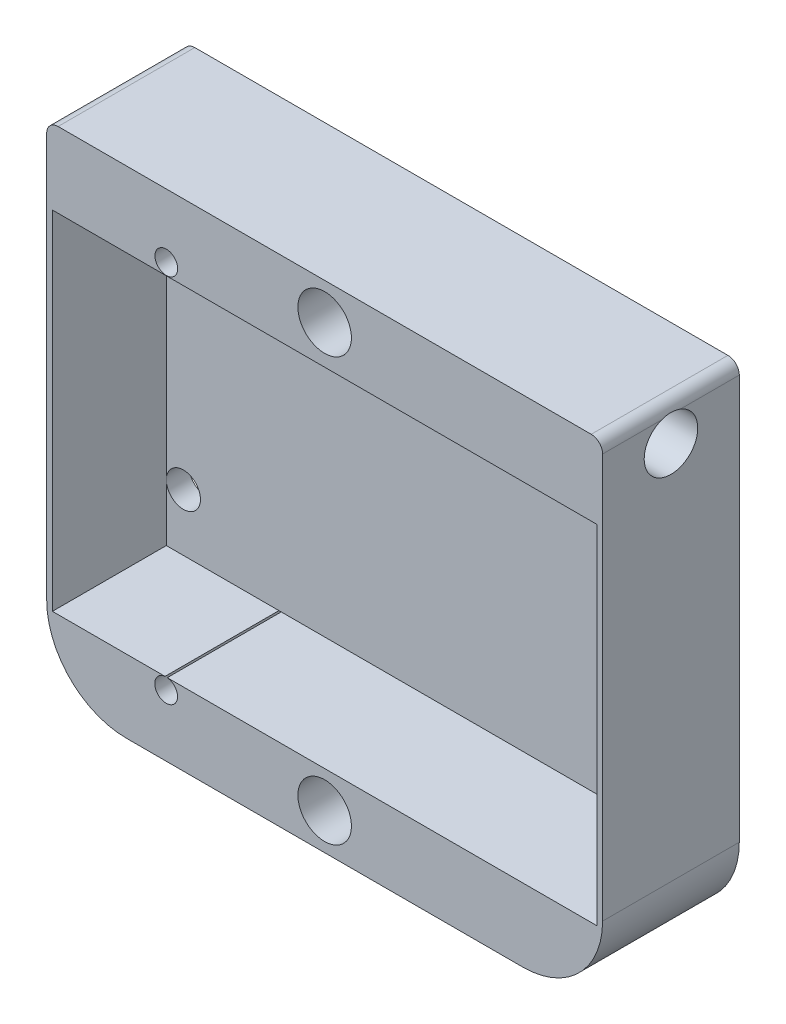
ISO-10303-21;
HEADER;
FILE_DESCRIPTION(('STEP AP214'),'2;1');
FILE_NAME('part.step','',(''),(''),'','','');
FILE_SCHEMA(('AUTOMOTIVE_DESIGN { 1 0 10303 214 1 1 1 1 }'));
ENDSEC;
DATA;
#1=APPLICATION_CONTEXT('core data for automotive mechanical design processes');
#2=APPLICATION_PROTOCOL_DEFINITION('international standard','automotive_design',2000,#1);
#3=PRODUCT_CONTEXT('',#1,'mechanical');
#4=PRODUCT('Part','Part','',(#3));
#5=PRODUCT_RELATED_PRODUCT_CATEGORY('part','',(#4));
#6=PRODUCT_DEFINITION_FORMATION('','',#4);
#7=PRODUCT_DEFINITION_CONTEXT('part definition',#1,'design');
#8=PRODUCT_DEFINITION('design','',#6,#7);
#9=PRODUCT_DEFINITION_SHAPE('','',#8);
#10=(LENGTH_UNIT() NAMED_UNIT(*) SI_UNIT(.MILLI.,.METRE.));
#11=(NAMED_UNIT(*) PLANE_ANGLE_UNIT() SI_UNIT($,.RADIAN.));
#12=(NAMED_UNIT(*) SI_UNIT($,.STERADIAN.) SOLID_ANGLE_UNIT());
#13=UNCERTAINTY_MEASURE_WITH_UNIT(LENGTH_MEASURE(1.E-05),#10,'distance_accuracy_value','');
#14=(GEOMETRIC_REPRESENTATION_CONTEXT(3) GLOBAL_UNCERTAINTY_ASSIGNED_CONTEXT((#13)) GLOBAL_UNIT_ASSIGNED_CONTEXT((#10,
#11,#12)) REPRESENTATION_CONTEXT('',''));
#15=CARTESIAN_POINT('',(0.,0.,0.));
#16=DIRECTION('',(0.,0.,1.));
#17=DIRECTION('',(1.,0.,0.));
#18=AXIS2_PLACEMENT_3D('',#15,#16,#17);
#19=CARTESIAN_POINT('',(35.2722534320795,-8.05348996464783,12.));
#20=DIRECTION('',(0.,1.,0.));
#21=DIRECTION('',(0.,0.,1.));
#22=AXIS2_PLACEMENT_3D('',#19,#20,#21);
#23=PLANE('',#22);
#24=DIRECTION('',(0.,0.,-1.));
#25=VECTOR('',#24,1.);
#26=CARTESIAN_POINT('',(-2.4409068013975,-8.05348996464783,19.));
#27=LINE('',#26,#25);
#28=CARTESIAN_POINT('',(-2.4409068013975,-8.05348996464783,12.));
#29=VERTEX_POINT('',#28);
#30=CARTESIAN_POINT('',(-2.4409068013975,-8.05348996464783,2.));
#31=VERTEX_POINT('',#30);
#32=EDGE_CURVE('E388',#29,#31,#27,.T.);
#33=ORIENTED_EDGE('',*,*,#32,.F.);
#34=DIRECTION('',(1.,0.,0.));
#35=VECTOR('',#34,1.);
#36=CARTESIAN_POINT('',(35.2722534320795,-8.05348996464783,12.));
#37=LINE('',#36,#35);
#38=CARTESIAN_POINT('',(35.2722534320795,-8.05348996464783,12.));
#39=VERTEX_POINT('',#38);
#40=EDGE_CURVE('E393',#29,#39,#37,.T.);
#41=ORIENTED_EDGE('',*,*,#40,.T.);
#42=DIRECTION('',(0.,0.,-1.));
#43=VECTOR('',#42,1.);
#44=CARTESIAN_POINT('',(35.2722534320795,-8.05348996464783,12.));
#45=LINE('',#44,#43);
#46=CARTESIAN_POINT('',(35.2722534320795,-8.05348996464783,2.));
#47=VERTEX_POINT('',#46);
#48=EDGE_CURVE('E200',#39,#47,#45,.T.);
#49=ORIENTED_EDGE('',*,*,#48,.T.);
#50=DIRECTION('',(-1.,0.,0.));
#51=VECTOR('',#50,1.);
#52=CARTESIAN_POINT('',(0.,-8.05348996464783,2.));
#53=LINE('',#52,#51);
#54=EDGE_CURVE('E190',#47,#31,#53,.T.);
#55=ORIENTED_EDGE('',*,*,#54,.T.);
#56=EDGE_LOOP('',(#33,#41,#49,#55));
#57=FACE_BOUND('',#56,.T.);
#58=ADVANCED_FACE('F42',(#57),#23,.T.);
#59=CARTESIAN_POINT('',(0.,0.,2.));
#60=DIRECTION('',(0.,0.,1.));
#61=DIRECTION('',(1.,0.,0.));
#62=AXIS2_PLACEMENT_3D('',#59,#60,#61);
#63=PLANE('',#62);
#64=DIRECTION('',(0.,-1.,0.));
#65=VECTOR('',#64,1.);
#66=CARTESIAN_POINT('',(-12.5277465679205,26.0581654725819,2.));
#67=LINE('',#66,#65);
#68=CARTESIAN_POINT('',(-12.5277465679205,22.4581654725819,2.));
#69=VERTEX_POINT('',#68);
#70=CARTESIAN_POINT('',(-12.5277465679205,-3.05348996464783,2.));
#71=VERTEX_POINT('',#70);
#72=EDGE_CURVE('E172',#69,#71,#67,.T.);
#73=ORIENTED_EDGE('',*,*,#72,.T.);
#74=CARTESIAN_POINT('',(-11.0277465679205,-3.05348996464783,2.));
#75=DIRECTION('',(0.,0.,1.));
#76=DIRECTION('',(1.,0.,0.));
#77=AXIS2_PLACEMENT_3D('',#74,#75,#76);
#78=CIRCLE('',#77,1.5);
#79=EDGE_CURVE('E57',#71,#71,#78,.T.);
#80=ORIENTED_EDGE('',*,*,#79,.F.);
#81=CARTESIAN_POINT('',(-12.5277465679205,-8.05348996464783,2.));
#82=VERTEX_POINT('',#81);
#83=EDGE_CURVE('E180',#71,#82,#67,.T.);
#84=ORIENTED_EDGE('',*,*,#83,.T.);
#85=CARTESIAN_POINT('',(-2.63981151573024,-8.05348996464783,2.));
#86=VERTEX_POINT('',#85);
#87=EDGE_CURVE('E398',#86,#82,#53,.T.);
#88=ORIENTED_EDGE('',*,*,#87,.F.);
#89=CARTESIAN_POINT('',(-2.54035915856387,-9.04853228970444,2.));
#90=DIRECTION('',(0.,0.,1.));
#91=DIRECTION('',(0.0994523571663701,0.995042325056604,0.));
#92=AXIS2_PLACEMENT_3D('',#89,#90,#91);
#93=CIRCLE('',#92,1.);
#94=EDGE_CURVE('E201',#31,#86,#93,.T.);
#95=ORIENTED_EDGE('',*,*,#94,.F.);
#96=ORIENTED_EDGE('',*,*,#54,.F.);
#97=DIRECTION('',(0.,1.,0.));
#98=VECTOR('',#97,1.);
#99=CARTESIAN_POINT('',(35.2722534320795,26.0581654725819,2.));
#100=LINE('',#99,#98);
#101=CARTESIAN_POINT('',(35.2722534320795,17.4581654725819,2.));
#102=VERTEX_POINT('',#101);
#103=EDGE_CURVE('E171',#47,#102,#100,.T.);
#104=ORIENTED_EDGE('',*,*,#103,.T.);
#105=CARTESIAN_POINT('',(33.7722534320795,17.4581654725819,2.));
#106=DIRECTION('',(0.,0.,1.));
#107=DIRECTION('',(1.,0.,0.));
#108=AXIS2_PLACEMENT_3D('',#105,#106,#107);
#109=CIRCLE('',#108,1.5);
#110=EDGE_CURVE('E62',#102,#102,#109,.T.);
#111=ORIENTED_EDGE('',*,*,#110,.F.);
#112=CARTESIAN_POINT('',(35.2722534320795,22.4581654725819,2.));
#113=VERTEX_POINT('',#112);
#114=EDGE_CURVE('E161',#102,#113,#100,.T.);
#115=ORIENTED_EDGE('',*,*,#114,.T.);
#116=DIRECTION('',(1.,0.,0.));
#117=VECTOR('',#116,1.);
#118=CARTESIAN_POINT('',(0.,22.4581654725819,2.));
#119=LINE('',#118,#117);
#120=EDGE_CURVE('E165',#69,#113,#119,.T.);
#121=ORIENTED_EDGE('',*,*,#120,.F.);
#122=EDGE_LOOP('',(#73,#80,#84,#88,#95,#96,#104,#111,#115,#121));
#123=FACE_BOUND('',#122,.T.);
#124=ADVANCED_FACE('F164',(#123),#63,.T.);
#125=CARTESIAN_POINT('',(0.,0.,0.));
#126=DIRECTION('',(0.,0.,1.));
#127=DIRECTION('',(1.,0.,0.));
#128=AXIS2_PLACEMENT_3D('',#125,#126,#127);
#129=PLANE('',#128);
#130=CARTESIAN_POINT('',(-11.0277465679205,-3.05348996464783,0.));
#131=DIRECTION('',(0.,0.,1.));
#132=DIRECTION('',(1.,0.,0.));
#133=AXIS2_PLACEMENT_3D('',#130,#131,#132);
#134=CIRCLE('',#133,1.5);
#135=CARTESIAN_POINT('',(-9.52774656792046,-3.05348996464783,0.));
#136=VERTEX_POINT('',#135);
#137=EDGE_CURVE('E46',#136,#136,#134,.T.);
#138=ORIENTED_EDGE('',*,*,#137,.T.);
#139=EDGE_LOOP('',(#138));
#140=FACE_BOUND('',#139,.T.);
#141=CARTESIAN_POINT('',(33.7722534320795,17.4581654725819,0.));
#142=DIRECTION('',(0.,0.,1.));
#143=DIRECTION('',(1.,0.,0.));
#144=AXIS2_PLACEMENT_3D('',#141,#142,#143);
#145=CIRCLE('',#144,1.5);
#146=CARTESIAN_POINT('',(35.2722534320795,17.4581654725819,0.));
#147=VERTEX_POINT('',#146);
#148=EDGE_CURVE('E305',#147,#147,#145,.T.);
#149=ORIENTED_EDGE('',*,*,#148,.T.);
#150=EDGE_LOOP('',(#149));
#151=FACE_BOUND('',#150,.T.);
#152=CARTESIAN_POINT('',(11.3722534320795,-11.2534899646478,0.));
#153=DIRECTION('',(0.,0.,1.));
#154=DIRECTION('',(1.,0.,0.));
#155=AXIS2_PLACEMENT_3D('',#152,#153,#154);
#156=CIRCLE('',#155,1.5);
#157=CARTESIAN_POINT('',(12.8722534320795,-11.2534899646478,0.));
#158=VERTEX_POINT('',#157);
#159=EDGE_CURVE('E301',#158,#158,#156,.T.);
#160=ORIENTED_EDGE('',*,*,#159,.T.);
#161=EDGE_LOOP('',(#160));
#162=FACE_BOUND('',#161,.T.);
#163=CARTESIAN_POINT('',(11.3722534320795,25.8581654725819,0.));
#164=DIRECTION('',(0.,0.,1.));
#165=DIRECTION('',(1.,0.,0.));
#166=AXIS2_PLACEMENT_3D('',#163,#164,#165);
#167=CIRCLE('',#166,1.5);
#168=CARTESIAN_POINT('',(12.8722534320795,25.8581654725819,0.));
#169=VERTEX_POINT('',#168);
#170=EDGE_CURVE('E298',#169,#169,#167,.T.);
#171=ORIENTED_EDGE('',*,*,#170,.T.);
#172=EDGE_LOOP('',(#171));
#173=FACE_BOUND('',#172,.T.);
#174=CARTESIAN_POINT('',(-2.52774656792047,23.4838790866618,0.));
#175=DIRECTION('',(0.,0.,-1.));
#176=DIRECTION('',(-1.,0.,0.));
#177=AXIS2_PLACEMENT_3D('',#174,#175,#176);
#178=CIRCLE('',#177,1.);
#179=CARTESIAN_POINT('',(-3.52774656792047,23.4838790866618,0.));
#180=VERTEX_POINT('',#179);
#181=EDGE_CURVE('E375',#180,#180,#178,.T.);
#182=ORIENTED_EDGE('',*,*,#181,.F.);
#183=EDGE_LOOP('',(#182));
#184=FACE_BOUND('',#183,.T.);
#185=CARTESIAN_POINT('',(-2.54035915856387,-9.04853228970444,0.));
#186=DIRECTION('',(0.,0.,-1.));
#187=DIRECTION('',(-1.,0.,0.));
#188=AXIS2_PLACEMENT_3D('',#185,#186,#187);
#189=CIRCLE('',#188,1.);
#190=CARTESIAN_POINT('',(-3.54035915856387,-9.04853228970444,0.));
#191=VERTEX_POINT('',#190);
#192=EDGE_CURVE('E374',#191,#191,#189,.T.);
#193=ORIENTED_EDGE('',*,*,#192,.F.);
#194=EDGE_LOOP('',(#193));
#195=FACE_BOUND('',#194,.T.);
#196=DIRECTION('',(1.,0.,0.));
#197=VECTOR('',#196,1.);
#198=CARTESIAN_POINT('',(-12.5277465679205,-14.4534899646478,0.));
#199=LINE('',#198,#197);
#200=CARTESIAN_POINT('',(-6.02774656792046,-14.4534899646478,0.));
#201=VERTEX_POINT('',#200);
#202=CARTESIAN_POINT('',(28.7722534320795,-14.4534899646478,0.));
#203=VERTEX_POINT('',#202);
#204=EDGE_CURVE('E361',#201,#203,#199,.T.);
#205=ORIENTED_EDGE('',*,*,#204,.F.);
#206=CARTESIAN_POINT('',(-6.02774656792046,-7.45348996464783,0.));
#207=DIRECTION('',(0.,0.,1.));
#208=DIRECTION('',(1.,0.,0.));
#209=AXIS2_PLACEMENT_3D('',#206,#207,#208);
#210=CIRCLE('',#209,7.);
#211=CARTESIAN_POINT('',(-13.0277465679205,-7.45348996464784,0.));
#212=VERTEX_POINT('',#211);
#213=EDGE_CURVE('E51',#201,#212,#210,.F.);
#214=ORIENTED_EDGE('',*,*,#213,.T.);
#215=DIRECTION('',(0.,-1.,0.));
#216=VECTOR('',#215,1.);
#217=CARTESIAN_POINT('',(-13.0277465679205,-14.4534899646478,0.));
#218=LINE('',#217,#216);
#219=CARTESIAN_POINT('',(-13.0277465679205,28.0581654725819,0.));
#220=VERTEX_POINT('',#219);
#221=EDGE_CURVE('E356',#220,#212,#218,.T.);
#222=ORIENTED_EDGE('',*,*,#221,.F.);
#223=CARTESIAN_POINT('',(-12.0277465679205,28.0581654725819,0.));
#224=DIRECTION('',(0.,0.,1.));
#225=DIRECTION('',(1.,0.,0.));
#226=AXIS2_PLACEMENT_3D('',#223,#224,#225);
#227=CIRCLE('',#226,1.);
#228=CARTESIAN_POINT('',(-12.0277465679205,29.0581654725819,0.));
#229=VERTEX_POINT('',#228);
#230=EDGE_CURVE('E275',#220,#229,#227,.F.);
#231=ORIENTED_EDGE('',*,*,#230,.T.);
#232=DIRECTION('',(-1.,0.,0.));
#233=VECTOR('',#232,1.);
#234=CARTESIAN_POINT('',(35.2722534320795,29.0581654725819,0.));
#235=LINE('',#234,#233);
#236=CARTESIAN_POINT('',(34.7722534320795,29.0581654725819,0.));
#237=VERTEX_POINT('',#236);
#238=EDGE_CURVE('E369',#237,#229,#235,.T.);
#239=ORIENTED_EDGE('',*,*,#238,.F.);
#240=CARTESIAN_POINT('',(34.7722534320795,28.0581654725819,0.));
#241=DIRECTION('',(0.,0.,1.));
#242=DIRECTION('',(1.,0.,0.));
#243=AXIS2_PLACEMENT_3D('',#240,#241,#242);
#244=CIRCLE('',#243,1.);
#245=CARTESIAN_POINT('',(35.7722534320795,28.0581654725819,0.));
#246=VERTEX_POINT('',#245);
#247=EDGE_CURVE('E423',#237,#246,#244,.F.);
#248=ORIENTED_EDGE('',*,*,#247,.T.);
#249=DIRECTION('',(0.,1.,0.));
#250=VECTOR('',#249,1.);
#251=CARTESIAN_POINT('',(35.7722534320795,29.0581654725819,0.));
#252=LINE('',#251,#250);
#253=CARTESIAN_POINT('',(35.7722534320795,-7.45348996464783,0.));
#254=VERTEX_POINT('',#253);
#255=EDGE_CURVE('E352',#254,#246,#252,.T.);
#256=ORIENTED_EDGE('',*,*,#255,.F.);
#257=CARTESIAN_POINT('',(28.7722534320795,-7.45348996464783,0.));
#258=DIRECTION('',(0.,0.,1.));
#259=DIRECTION('',(1.,0.,0.));
#260=AXIS2_PLACEMENT_3D('',#257,#258,#259);
#261=CIRCLE('',#260,7.);
#262=EDGE_CURVE('E295',#254,#203,#261,.F.);
#263=ORIENTED_EDGE('',*,*,#262,.T.);
#264=EDGE_LOOP('',(#205,#214,#222,#231,#239,#248,#256,#263));
#265=FACE_BOUND('',#264,.T.);
#266=ADVANCED_FACE('F221',(#140,#151,#162,#173,#184,#195,#265),#129,.F.);
#267=CARTESIAN_POINT('',(35.2722534320795,22.4581654725819,12.));
#268=DIRECTION('',(0.,-1.,0.));
#269=DIRECTION('',(0.,0.,-1.));
#270=AXIS2_PLACEMENT_3D('',#267,#268,#269);
#271=PLANE('',#270);
#272=DIRECTION('',(0.,0.,-1.));
#273=VECTOR('',#272,1.);
#274=CARTESIAN_POINT('',(-12.5277465679205,22.4581654725819,12.));
#275=LINE('',#274,#273);
#276=CARTESIAN_POINT('',(-12.5277465679205,22.4581654725819,12.));
#277=VERTEX_POINT('',#276);
#278=EDGE_CURVE('E179',#277,#69,#275,.T.);
#279=ORIENTED_EDGE('',*,*,#278,.T.);
#280=ORIENTED_EDGE('',*,*,#120,.T.);
#281=DIRECTION('',(0.,0.,-1.));
#282=VECTOR('',#281,1.);
#283=CARTESIAN_POINT('',(35.2722534320795,22.4581654725819,12.));
#284=LINE('',#283,#282);
#285=CARTESIAN_POINT('',(35.2722534320795,22.4581654725819,12.));
#286=VERTEX_POINT('',#285);
#287=EDGE_CURVE('E177',#286,#113,#284,.T.);
#288=ORIENTED_EDGE('',*,*,#287,.F.);
#289=DIRECTION('',(-1.,0.,0.));
#290=VECTOR('',#289,1.);
#291=CARTESIAN_POINT('',(35.2722534320795,22.4581654725819,12.));
#292=LINE('',#291,#290);
#293=EDGE_CURVE('E187',#286,#277,#292,.T.);
#294=ORIENTED_EDGE('',*,*,#293,.T.);
#295=EDGE_LOOP('',(#279,#280,#288,#294));
#296=FACE_BOUND('',#295,.T.);
#297=ADVANCED_FACE('F175',(#296),#271,.T.);
#298=CARTESIAN_POINT('',(0.,0.,12.));
#299=DIRECTION('',(0.,0.,-1.));
#300=DIRECTION('',(-1.,0.,0.));
#301=AXIS2_PLACEMENT_3D('',#298,#299,#300);
#302=PLANE('',#301);
#303=CARTESIAN_POINT('',(11.3722534320795,-11.2534899646478,12.));
#304=DIRECTION('',(0.,0.,1.));
#305=DIRECTION('',(1.,0.,0.));
#306=AXIS2_PLACEMENT_3D('',#303,#304,#305);
#307=CIRCLE('',#306,2.35);
#308=CARTESIAN_POINT('',(13.7222534320795,-11.2534899646478,12.));
#309=VERTEX_POINT('',#308);
#310=EDGE_CURVE('E322',#309,#309,#307,.T.);
#311=ORIENTED_EDGE('',*,*,#310,.F.);
#312=EDGE_LOOP('',(#311));
#313=FACE_BOUND('',#312,.T.);
#314=CARTESIAN_POINT('',(11.3722534320795,25.8581654725819,12.));
#315=DIRECTION('',(0.,0.,1.));
#316=DIRECTION('',(1.,0.,0.));
#317=AXIS2_PLACEMENT_3D('',#314,#315,#316);
#318=CIRCLE('',#317,2.35);
#319=CARTESIAN_POINT('',(13.7222534320795,25.8581654725819,12.));
#320=VERTEX_POINT('',#319);
#321=EDGE_CURVE('E325',#320,#320,#318,.T.);
#322=ORIENTED_EDGE('',*,*,#321,.F.);
#323=EDGE_LOOP('',(#322));
#324=FACE_BOUND('',#323,.T.);
#325=DIRECTION('',(0.,1.,0.));
#326=VECTOR('',#325,1.);
#327=CARTESIAN_POINT('',(-13.0277465679205,-14.4534899646478,12.));
#328=LINE('',#327,#326);
#329=CARTESIAN_POINT('',(-13.0277465679205,-7.45348996464784,12.));
#330=VERTEX_POINT('',#329);
#331=CARTESIAN_POINT('',(-13.0277465679205,28.0581654725819,12.));
#332=VERTEX_POINT('',#331);
#333=EDGE_CURVE('E359',#330,#332,#328,.T.);
#334=ORIENTED_EDGE('',*,*,#333,.F.);
#335=CARTESIAN_POINT('',(-6.02774656792046,-7.45348996464783,12.));
#336=DIRECTION('',(0.,0.,-1.));
#337=DIRECTION('',(-1.,0.,0.));
#338=AXIS2_PLACEMENT_3D('',#335,#336,#337);
#339=CIRCLE('',#338,7.);
#340=CARTESIAN_POINT('',(-6.02774656792046,-14.4534899646478,12.));
#341=VERTEX_POINT('',#340);
#342=EDGE_CURVE('E289',#330,#341,#339,.F.);
#343=ORIENTED_EDGE('',*,*,#342,.T.);
#344=DIRECTION('',(-1.,0.,0.));
#345=VECTOR('',#344,1.);
#346=CARTESIAN_POINT('',(35.2722534320795,-14.4534899646478,12.));
#347=LINE('',#346,#345);
#348=CARTESIAN_POINT('',(28.7722534320795,-14.4534899646478,12.));
#349=VERTEX_POINT('',#348);
#350=EDGE_CURVE('E366',#349,#341,#347,.T.);
#351=ORIENTED_EDGE('',*,*,#350,.F.);
#352=CARTESIAN_POINT('',(28.7722534320795,-7.45348996464783,12.));
#353=DIRECTION('',(0.,0.,-1.));
#354=DIRECTION('',(-1.,0.,0.));
#355=AXIS2_PLACEMENT_3D('',#352,#353,#354);
#356=CIRCLE('',#355,7.);
#357=CARTESIAN_POINT('',(35.7722534320795,-7.45348996464783,12.));
#358=VERTEX_POINT('',#357);
#359=EDGE_CURVE('E287',#349,#358,#356,.F.);
#360=ORIENTED_EDGE('',*,*,#359,.T.);
#361=DIRECTION('',(0.,-1.,0.));
#362=VECTOR('',#361,1.);
#363=CARTESIAN_POINT('',(35.7722534320795,29.0581654725819,12.));
#364=LINE('',#363,#362);
#365=CARTESIAN_POINT('',(35.7722534320795,28.0581654725819,12.));
#366=VERTEX_POINT('',#365);
#367=EDGE_CURVE('E349',#366,#358,#364,.T.);
#368=ORIENTED_EDGE('',*,*,#367,.F.);
#369=CARTESIAN_POINT('',(34.7722534320795,28.0581654725819,12.));
#370=DIRECTION('',(0.,0.,-1.));
#371=DIRECTION('',(-1.,0.,0.));
#372=AXIS2_PLACEMENT_3D('',#369,#370,#371);
#373=CIRCLE('',#372,1.);
#374=CARTESIAN_POINT('',(34.7722534320795,29.0581654725819,12.));
#375=VERTEX_POINT('',#374);
#376=EDGE_CURVE('E243',#366,#375,#373,.F.);
#377=ORIENTED_EDGE('',*,*,#376,.T.);
#378=DIRECTION('',(1.,0.,0.));
#379=VECTOR('',#378,1.);
#380=CARTESIAN_POINT('',(-12.5277465679205,29.0581654725819,12.));
#381=LINE('',#380,#379);
#382=CARTESIAN_POINT('',(-12.0277465679205,29.0581654725819,12.));
#383=VERTEX_POINT('',#382);
#384=EDGE_CURVE('E372',#383,#375,#381,.T.);
#385=ORIENTED_EDGE('',*,*,#384,.F.);
#386=CARTESIAN_POINT('',(-12.0277465679205,28.0581654725819,12.));
#387=DIRECTION('',(0.,0.,-1.));
#388=DIRECTION('',(-1.,0.,0.));
#389=AXIS2_PLACEMENT_3D('',#386,#387,#388);
#390=CIRCLE('',#389,1.);
#391=EDGE_CURVE('E281',#383,#332,#390,.F.);
#392=ORIENTED_EDGE('',*,*,#391,.T.);
#393=EDGE_LOOP('',(#334,#343,#351,#360,#368,#377,#385,#392));
#394=FACE_BOUND('',#393,.T.);
#395=CARTESIAN_POINT('',(-2.52774656792047,23.4838790866618,12.));
#396=DIRECTION('',(0.,0.,-1.));
#397=DIRECTION('',(-1.,0.,0.));
#398=AXIS2_PLACEMENT_3D('',#395,#396,#397);
#399=CIRCLE('',#398,1.);
#400=CARTESIAN_POINT('',(-3.52774656792047,23.4838790866618,12.));
#401=VERTEX_POINT('',#400);
#402=EDGE_CURVE('E197',#401,#401,#399,.T.);
#403=ORIENTED_EDGE('',*,*,#402,.T.);
#404=EDGE_LOOP('',(#403));
#405=FACE_BOUND('',#404,.T.);
#406=ORIENTED_EDGE('',*,*,#293,.F.);
#407=DIRECTION('',(0.,-1.,0.));
#408=VECTOR('',#407,1.);
#409=CARTESIAN_POINT('',(35.2722534320795,29.0581654725819,12.));
#410=LINE('',#409,#408);
#411=EDGE_CURVE('E186',#286,#39,#410,.T.);
#412=ORIENTED_EDGE('',*,*,#411,.T.);
#413=ORIENTED_EDGE('',*,*,#40,.F.);
#414=CARTESIAN_POINT('',(-2.54035915856387,-9.04853228970444,12.));
#415=DIRECTION('',(0.,0.,1.));
#416=DIRECTION('',(1.,0.,0.));
#417=AXIS2_PLACEMENT_3D('',#414,#415,#416);
#418=CIRCLE('',#417,1.);
#419=CARTESIAN_POINT('',(-2.63981151573024,-8.05348996464783,12.));
#420=VERTEX_POINT('',#419);
#421=EDGE_CURVE('E194',#420,#29,#418,.T.);
#422=ORIENTED_EDGE('',*,*,#421,.F.);
#423=CARTESIAN_POINT('',(-12.5277465679205,-8.05348996464783,12.));
#424=VERTEX_POINT('',#423);
#425=EDGE_CURVE('E396',#424,#420,#37,.T.);
#426=ORIENTED_EDGE('',*,*,#425,.F.);
#427=DIRECTION('',(0.,1.,0.));
#428=VECTOR('',#427,1.);
#429=CARTESIAN_POINT('',(-12.5277465679205,-14.4534899646478,12.));
#430=LINE('',#429,#428);
#431=EDGE_CURVE('E354',#424,#277,#430,.T.);
#432=ORIENTED_EDGE('',*,*,#431,.T.);
#433=EDGE_LOOP('',(#406,#412,#413,#422,#426,#432));
#434=FACE_BOUND('',#433,.T.);
#435=ADVANCED_FACE('F444',(#313,#324,#394,#405,#434),#302,.F.);
#436=DIRECTION('',(0.,0.,-1.));
#437=VECTOR('',#436,1.);
#438=CARTESIAN_POINT('',(-2.63981151573024,-8.05348996464783,19.));
#439=LINE('',#438,#437);
#440=EDGE_CURVE('E378',#86,#420,#439,.F.);
#441=ORIENTED_EDGE('',*,*,#440,.F.);
#442=ORIENTED_EDGE('',*,*,#87,.T.);
#443=DIRECTION('',(0.,0.,-1.));
#444=VECTOR('',#443,1.);
#445=CARTESIAN_POINT('',(-12.5277465679205,-8.05348996464783,12.));
#446=LINE('',#445,#444);
#447=EDGE_CURVE('E390',#424,#82,#446,.T.);
#448=ORIENTED_EDGE('',*,*,#447,.F.);
#449=ORIENTED_EDGE('',*,*,#425,.T.);
#450=EDGE_LOOP('',(#441,#442,#448,#449));
#451=FACE_BOUND('',#450,.T.);
#452=ADVANCED_FACE('F470',(#451),#23,.T.);
#453=CARTESIAN_POINT('',(-2.54035915856387,-9.04853228970444,19.));
#454=DIRECTION('',(0.,0.,-1.));
#455=DIRECTION('',(-1.,0.,0.));
#456=AXIS2_PLACEMENT_3D('',#453,#454,#455);
#457=CYLINDRICAL_SURFACE('',#456,1.);
#458=ORIENTED_EDGE('',*,*,#94,.T.);
#459=ORIENTED_EDGE('',*,*,#440,.T.);
#460=ORIENTED_EDGE('',*,*,#421,.T.);
#461=ORIENTED_EDGE('',*,*,#32,.T.);
#462=EDGE_LOOP('',(#458,#459,#460,#461));
#463=FACE_BOUND('',#462,.T.);
#464=ORIENTED_EDGE('',*,*,#192,.T.);
#465=EDGE_LOOP('',(#464));
#466=FACE_BOUND('',#465,.T.);
#467=ADVANCED_FACE('F477',(#463,#466),#457,.F.);
#468=CARTESIAN_POINT('',(-2.52774656792047,23.4838790866618,19.));
#469=DIRECTION('',(0.,0.,-1.));
#470=DIRECTION('',(-1.,0.,0.));
#471=AXIS2_PLACEMENT_3D('',#468,#469,#470);
#472=CYLINDRICAL_SURFACE('',#471,1.);
#473=ORIENTED_EDGE('',*,*,#181,.T.);
#474=EDGE_LOOP('',(#473));
#475=FACE_BOUND('',#474,.T.);
#476=ORIENTED_EDGE('',*,*,#402,.F.);
#477=EDGE_LOOP('',(#476));
#478=FACE_BOUND('',#477,.T.);
#479=ADVANCED_FACE('F483',(#475,#478),#472,.F.);
#480=CARTESIAN_POINT('',(0.,29.0581654725819,0.));
#481=DIRECTION('',(0.,1.,0.));
#482=DIRECTION('',(0.,0.,1.));
#483=AXIS2_PLACEMENT_3D('',#480,#481,#482);
#484=PLANE('',#483);
#485=ORIENTED_EDGE('',*,*,#238,.T.);
#486=DIRECTION('',(0.,0.,-1.));
#487=VECTOR('',#486,1.);
#488=CARTESIAN_POINT('',(-12.0277465679205,29.0581654725819,12.));
#489=LINE('',#488,#487);
#490=EDGE_CURVE('E279',#229,#383,#489,.F.);
#491=ORIENTED_EDGE('',*,*,#490,.T.);
#492=ORIENTED_EDGE('',*,*,#384,.T.);
#493=DIRECTION('',(0.,0.,1.));
#494=VECTOR('',#493,1.);
#495=CARTESIAN_POINT('',(34.7722534320795,29.0581654725819,0.));
#496=LINE('',#495,#494);
#497=EDGE_CURVE('E420',#375,#237,#496,.F.);
#498=ORIENTED_EDGE('',*,*,#497,.T.);
#499=EDGE_LOOP('',(#485,#491,#492,#498));
#500=FACE_BOUND('',#499,.T.);
#501=ADVANCED_FACE('F443',(#500),#484,.T.);
#502=CARTESIAN_POINT('',(0.,-14.4534899646478,0.));
#503=DIRECTION('',(0.,-1.,0.));
#504=DIRECTION('',(1.,0.,0.));
#505=AXIS2_PLACEMENT_3D('',#502,#503,#504);
#506=PLANE('',#505);
#507=ORIENTED_EDGE('',*,*,#350,.T.);
#508=DIRECTION('',(0.,0.,1.));
#509=VECTOR('',#508,1.);
#510=CARTESIAN_POINT('',(-6.02774656792046,-14.4534899646478,0.));
#511=LINE('',#510,#509);
#512=EDGE_CURVE('E293',#341,#201,#511,.F.);
#513=ORIENTED_EDGE('',*,*,#512,.T.);
#514=ORIENTED_EDGE('',*,*,#204,.T.);
#515=DIRECTION('',(0.,0.,-1.));
#516=VECTOR('',#515,1.);
#517=CARTESIAN_POINT('',(28.7722534320795,-14.4534899646478,0.));
#518=LINE('',#517,#516);
#519=EDGE_CURVE('E291',#203,#349,#518,.F.);
#520=ORIENTED_EDGE('',*,*,#519,.T.);
#521=EDGE_LOOP('',(#507,#513,#514,#520));
#522=FACE_BOUND('',#521,.T.);
#523=ADVANCED_FACE('F452',(#522),#506,.T.);
#524=CARTESIAN_POINT('',(-13.0277465679205,0.,0.));
#525=DIRECTION('',(1.,0.,0.));
#526=DIRECTION('',(0.,1.,0.));
#527=AXIS2_PLACEMENT_3D('',#524,#525,#526);
#528=PLANE('',#527);
#529=ORIENTED_EDGE('',*,*,#221,.T.);
#530=DIRECTION('',(0.,0.,1.));
#531=VECTOR('',#530,1.);
#532=CARTESIAN_POINT('',(-13.0277465679205,-7.45348996464784,12.));
#533=LINE('',#532,#531);
#534=EDGE_CURVE('E284',#212,#330,#533,.T.);
#535=ORIENTED_EDGE('',*,*,#534,.T.);
#536=ORIENTED_EDGE('',*,*,#333,.T.);
#537=DIRECTION('',(0.,0.,-1.));
#538=VECTOR('',#537,1.);
#539=CARTESIAN_POINT('',(-13.0277465679205,28.0581654725819,0.));
#540=LINE('',#539,#538);
#541=CARTESIAN_POINT('',(-13.0277465679205,28.0581654725819,6.82613558209292));
#542=VERTEX_POINT('',#541);
#543=EDGE_CURVE('E276',#332,#542,#540,.T.);
#544=ORIENTED_EDGE('',*,*,#543,.T.);
#545=CARTESIAN_POINT('',(-13.0277465679205,25.8581654725819,6.));
#546=DIRECTION('',(-1.,0.,0.));
#547=DIRECTION('',(0.,-1.,0.));
#548=AXIS2_PLACEMENT_3D('',#545,#546,#547);
#549=CIRCLE('',#548,2.35);
#550=CARTESIAN_POINT('',(-13.0277465679205,28.0581654725819,5.17386441790708));
#551=VERTEX_POINT('',#550);
#552=EDGE_CURVE('E340',#551,#542,#549,.T.);
#553=ORIENTED_EDGE('',*,*,#552,.F.);
#554=DIRECTION('',(0.,0.,-1.));
#555=VECTOR('',#554,1.);
#556=CARTESIAN_POINT('',(-13.0277465679205,28.0581654725819,0.));
#557=LINE('',#556,#555);
#558=EDGE_CURVE('E426',#551,#220,#557,.T.);
#559=ORIENTED_EDGE('',*,*,#558,.T.);
#560=EDGE_LOOP('',(#529,#535,#536,#544,#553,#559));
#561=FACE_BOUND('',#560,.T.);
#562=ADVANCED_FACE('F434',(#561),#528,.F.);
#563=CARTESIAN_POINT('',(-12.5277465679205,0.,0.));
#564=DIRECTION('',(1.,0.,0.));
#565=DIRECTION('',(0.,1.,0.));
#566=AXIS2_PLACEMENT_3D('',#563,#564,#565);
#567=PLANE('',#566);
#568=ORIENTED_EDGE('',*,*,#431,.F.);
#569=ORIENTED_EDGE('',*,*,#447,.T.);
#570=ORIENTED_EDGE('',*,*,#83,.F.);
#571=ORIENTED_EDGE('',*,*,#72,.F.);
#572=ORIENTED_EDGE('',*,*,#278,.F.);
#573=EDGE_LOOP('',(#568,#569,#570,#571,#572));
#574=FACE_BOUND('',#573,.T.);
#575=ADVANCED_FACE('F493',(#574),#567,.T.);
#576=CARTESIAN_POINT('',(35.7722534320795,0.,0.));
#577=DIRECTION('',(1.,0.,0.));
#578=DIRECTION('',(0.,1.,0.));
#579=AXIS2_PLACEMENT_3D('',#576,#577,#578);
#580=PLANE('',#579);
#581=ORIENTED_EDGE('',*,*,#367,.T.);
#582=DIRECTION('',(0.,0.,-1.));
#583=VECTOR('',#582,1.);
#584=CARTESIAN_POINT('',(35.7722534320795,-7.45348996464783,0.));
#585=LINE('',#584,#583);
#586=EDGE_CURVE('E11',#358,#254,#585,.T.);
#587=ORIENTED_EDGE('',*,*,#586,.T.);
#588=ORIENTED_EDGE('',*,*,#255,.T.);
#589=DIRECTION('',(0.,0.,1.));
#590=VECTOR('',#589,1.);
#591=CARTESIAN_POINT('',(35.7722534320795,28.0581654725819,0.));
#592=LINE('',#591,#590);
#593=CARTESIAN_POINT('',(35.7722534320795,28.0581654725819,5.17386441790708));
#594=VERTEX_POINT('',#593);
#595=EDGE_CURVE('E244',#246,#594,#592,.T.);
#596=ORIENTED_EDGE('',*,*,#595,.T.);
#597=CARTESIAN_POINT('',(35.7722534320795,25.8581654725819,6.));
#598=DIRECTION('',(1.,0.,0.));
#599=DIRECTION('',(0.,1.,0.));
#600=AXIS2_PLACEMENT_3D('',#597,#598,#599);
#601=CIRCLE('',#600,2.35);
#602=CARTESIAN_POINT('',(35.7722534320795,28.0581654725819,6.82613558209292));
#603=VERTEX_POINT('',#602);
#604=EDGE_CURVE('E321',#603,#594,#601,.T.);
#605=ORIENTED_EDGE('',*,*,#604,.F.);
#606=DIRECTION('',(0.,0.,1.));
#607=VECTOR('',#606,1.);
#608=CARTESIAN_POINT('',(35.7722534320795,28.0581654725819,0.));
#609=LINE('',#608,#607);
#610=EDGE_CURVE('E196',#603,#366,#609,.T.);
#611=ORIENTED_EDGE('',*,*,#610,.T.);
#612=EDGE_LOOP('',(#581,#587,#588,#596,#605,#611));
#613=FACE_BOUND('',#612,.T.);
#614=ADVANCED_FACE('F412',(#613),#580,.T.);
#615=CARTESIAN_POINT('',(35.2722534320795,0.,0.));
#616=DIRECTION('',(1.,0.,0.));
#617=DIRECTION('',(0.,1.,0.));
#618=AXIS2_PLACEMENT_3D('',#615,#616,#617);
#619=PLANE('',#618);
#620=ORIENTED_EDGE('',*,*,#48,.F.);
#621=ORIENTED_EDGE('',*,*,#411,.F.);
#622=ORIENTED_EDGE('',*,*,#287,.T.);
#623=ORIENTED_EDGE('',*,*,#114,.F.);
#624=ORIENTED_EDGE('',*,*,#103,.F.);
#625=EDGE_LOOP('',(#620,#621,#622,#623,#624));
#626=FACE_BOUND('',#625,.T.);
#627=ADVANCED_FACE('F184',(#626),#619,.F.);
#628=CARTESIAN_POINT('',(-9.02774656792047,25.8581654725819,6.));
#629=DIRECTION('',(-1.,0.,0.));
#630=DIRECTION('',(0.,-1.,0.));
#631=AXIS2_PLACEMENT_3D('',#628,#629,#630);
#632=PLANE('',#631);
#633=CARTESIAN_POINT('',(-9.02774656792047,25.8581654725819,6.));
#634=DIRECTION('',(-1.,0.,0.));
#635=DIRECTION('',(0.,-1.,0.));
#636=AXIS2_PLACEMENT_3D('',#633,#634,#635);
#637=CIRCLE('',#636,2.35);
#638=CARTESIAN_POINT('',(-9.02774656792047,23.5081654725819,6.));
#639=VERTEX_POINT('',#638);
#640=EDGE_CURVE('E336',#639,#639,#637,.T.);
#641=ORIENTED_EDGE('',*,*,#640,.T.);
#642=EDGE_LOOP('',(#641));
#643=FACE_BOUND('',#642,.T.);
#644=CARTESIAN_POINT('',(-9.02774656792047,25.8581654725819,6.));
#645=DIRECTION('',(-1.,0.,0.));
#646=DIRECTION('',(0.,-1.,0.));
#647=AXIS2_PLACEMENT_3D('',#644,#645,#646);
#648=CIRCLE('',#647,1.5);
#649=CARTESIAN_POINT('',(-9.02774656792047,24.3581654725819,6.));
#650=VERTEX_POINT('',#649);
#651=EDGE_CURVE('E339',#650,#650,#648,.F.);
#652=ORIENTED_EDGE('',*,*,#651,.T.);
#653=EDGE_LOOP('',(#652));
#654=FACE_BOUND('',#653,.T.);
#655=ADVANCED_FACE('F256',(#643,#654),#632,.T.);
#656=CARTESIAN_POINT('',(-9.02774656792047,25.8581654725819,6.));
#657=DIRECTION('',(-1.,0.,0.));
#658=DIRECTION('',(0.,-1.,0.));
#659=AXIS2_PLACEMENT_3D('',#656,#657,#658);
#660=CYLINDRICAL_SURFACE('',#659,2.35);
#661=ORIENTED_EDGE('',*,*,#640,.F.);
#662=EDGE_LOOP('',(#661));
#663=FACE_BOUND('',#662,.T.);
#664=ORIENTED_EDGE('',*,*,#552,.T.);
#665=CARTESIAN_POINT('',(-13.0277465679205,28.0581654725819,6.82613558209292));
#666=CARTESIAN_POINT('',(-13.0277066418477,28.0812624515876,6.76464598442542));
#667=CARTESIAN_POINT('',(-13.0269450817053,28.1017658080327,6.70219494225155));
#668=CARTESIAN_POINT('',(-13.0247677070465,28.1374760798323,6.57580216395974));
#669=CARTESIAN_POINT('',(-13.02335185413,28.15268268423,6.51186034055742));
#670=CARTESIAN_POINT('',(-13.0206536781067,28.1777006808663,6.38285764593195));
#671=CARTESIAN_POINT('',(-13.0193714971463,28.1875063762943,6.31779566747002));
#672=CARTESIAN_POINT('',(-13.0174286655946,28.20162938958,6.18707571002219));
#673=CARTESIAN_POINT('',(-13.0167679429572,28.2059473436556,6.12141780101421));
#674=CARTESIAN_POINT('',(-13.0162961256645,28.20906939589,5.98972115747087));
#675=CARTESIAN_POINT('',(-13.0164882278749,28.2078527468313,5.92368191834624));
#676=CARTESIAN_POINT('',(-13.0176641299891,28.1998674328638,5.79194675728701));
#677=CARTESIAN_POINT('',(-13.0186479332947,28.193098744099,5.72625083682881));
#678=CARTESIAN_POINT('',(-13.0210509489435,28.1740858613416,5.59584042824895));
#679=CARTESIAN_POINT('',(-13.0224690439737,28.1618556816931,5.53112386374859));
#680=CARTESIAN_POINT('',(-13.0251286438561,28.132012455873,5.40297123575963));
#681=CARTESIAN_POINT('',(-13.0263702657166,28.1144030009845,5.33953434797052));
#682=CARTESIAN_POINT('',(-13.0272997459592,28.0885678235303,5.2596369460769));
#683=CARTESIAN_POINT('',(-13.027461921757,28.0827640871701,5.24237685591751));
#684=CARTESIAN_POINT('',(-13.0276853275722,28.0707613140889,5.20800855994167));
#685=CARTESIAN_POINT('',(-13.0277466332069,28.064562577105,5.19090024992161));
#686=CARTESIAN_POINT('',(-13.0277465679205,28.0581654725819,5.17386441790708));
#687=B_SPLINE_CURVE_WITH_KNOTS('',3,(#665,#666,#667,#668,#669,#670,#671,#672,#673,#674,#675,
#676,#677,#678,#679,#680,#681,#682,#683,#684,#685,#686),.UNSPECIFIED.,.F.,.F.,(4,2,2,2,2,2,2,2,
2,2,4),(0.,0.196976792172796,0.393965146328734,0.591160885335261,0.788333760482859,
0.986246372937273,1.18415983578843,1.38156833942468,1.57884533721524,1.63347325388888,
1.68806019999062),.UNSPECIFIED.);
#688=EDGE_CURVE('E268',#542,#551,#687,.T.);
#689=ORIENTED_EDGE('',*,*,#688,.T.);
#690=EDGE_LOOP('',(#664,#689));
#691=FACE_BOUND('',#690,.T.);
#692=ADVANCED_FACE('F259',(#663,#691),#660,.F.);
#693=CARTESIAN_POINT('',(-4.02774656792047,25.8581654725819,6.));
#694=DIRECTION('',(-1.,0.,0.));
#695=DIRECTION('',(0.,-1.,0.));
#696=AXIS2_PLACEMENT_3D('',#693,#694,#695);
#697=PLANE('',#696);
#698=CARTESIAN_POINT('',(-4.02774656792047,25.8581654725819,6.));
#699=DIRECTION('',(-1.,0.,0.));
#700=DIRECTION('',(0.,-1.,0.));
#701=AXIS2_PLACEMENT_3D('',#698,#699,#700);
#702=CIRCLE('',#701,1.5);
#703=CARTESIAN_POINT('',(-4.02774656792047,24.3581654725819,6.));
#704=VERTEX_POINT('',#703);
#705=EDGE_CURVE('E346',#704,#704,#702,.T.);
#706=ORIENTED_EDGE('',*,*,#705,.T.);
#707=EDGE_LOOP('',(#706));
#708=FACE_BOUND('',#707,.T.);
#709=ADVANCED_FACE('F264',(#708),#697,.T.);
#710=CARTESIAN_POINT('',(-4.02774656792047,25.8581654725819,6.));
#711=DIRECTION('',(-1.,0.,0.));
#712=DIRECTION('',(0.,-1.,0.));
#713=AXIS2_PLACEMENT_3D('',#710,#711,#712);
#714=CYLINDRICAL_SURFACE('',#713,1.5);
#715=ORIENTED_EDGE('',*,*,#705,.F.);
#716=EDGE_LOOP('',(#715));
#717=FACE_BOUND('',#716,.T.);
#718=ORIENTED_EDGE('',*,*,#651,.F.);
#719=EDGE_LOOP('',(#718));
#720=FACE_BOUND('',#719,.T.);
#721=ADVANCED_FACE('F521',(#717,#720),#714,.F.);
#722=CARTESIAN_POINT('',(31.7722534320795,25.8581654725819,6.));
#723=DIRECTION('',(1.,0.,0.));
#724=DIRECTION('',(0.,1.,0.));
#725=AXIS2_PLACEMENT_3D('',#722,#723,#724);
#726=PLANE('',#725);
#727=CARTESIAN_POINT('',(31.7722534320795,25.8581654725819,6.));
#728=DIRECTION('',(1.,0.,0.));
#729=DIRECTION('',(0.,1.,0.));
#730=AXIS2_PLACEMENT_3D('',#727,#728,#729);
#731=CIRCLE('',#730,2.35);
#732=CARTESIAN_POINT('',(31.7722534320795,28.2081654725819,6.));
#733=VERTEX_POINT('',#732);
#734=EDGE_CURVE('E330',#733,#733,#731,.T.);
#735=ORIENTED_EDGE('',*,*,#734,.T.);
#736=EDGE_LOOP('',(#735));
#737=FACE_BOUND('',#736,.T.);
#738=CARTESIAN_POINT('',(31.7722534320795,25.8581654725819,6.));
#739=DIRECTION('',(1.,0.,0.));
#740=DIRECTION('',(0.,1.,0.));
#741=AXIS2_PLACEMENT_3D('',#738,#739,#740);
#742=CIRCLE('',#741,1.5);
#743=CARTESIAN_POINT('',(31.7722534320795,27.3581654725819,6.));
#744=VERTEX_POINT('',#743);
#745=EDGE_CURVE('E333',#744,#744,#742,.F.);
#746=ORIENTED_EDGE('',*,*,#745,.T.);
#747=EDGE_LOOP('',(#746));
#748=FACE_BOUND('',#747,.T.);
#749=ADVANCED_FACE('F253',(#737,#748),#726,.T.);
#750=CARTESIAN_POINT('',(31.7722534320795,25.8581654725819,6.));
#751=DIRECTION('',(1.,0.,0.));
#752=DIRECTION('',(0.,1.,0.));
#753=AXIS2_PLACEMENT_3D('',#750,#751,#752);
#754=CYLINDRICAL_SURFACE('',#753,2.35);
#755=ORIENTED_EDGE('',*,*,#734,.F.);
#756=EDGE_LOOP('',(#755));
#757=FACE_BOUND('',#756,.T.);
#758=ORIENTED_EDGE('',*,*,#604,.T.);
#759=CARTESIAN_POINT('',(35.7722534320795,28.0581654725819,5.17386441790708));
#760=CARTESIAN_POINT('',(35.7722135060068,28.0812624515876,5.23535401557458));
#761=CARTESIAN_POINT('',(35.7714519458643,28.1017658080327,5.29780505774845));
#762=CARTESIAN_POINT('',(35.7692745712056,28.1374760798323,5.42419783604026));
#763=CARTESIAN_POINT('',(35.7678587182891,28.15268268423,5.48813965944258));
#764=CARTESIAN_POINT('',(35.7651605422658,28.1777006808663,5.61714235406805));
#765=CARTESIAN_POINT('',(35.7638783613054,28.1875063762943,5.68220433252997));
#766=CARTESIAN_POINT('',(35.7619355297537,28.20162938958,5.81292428997781));
#767=CARTESIAN_POINT('',(35.7612748071163,28.2059473436556,5.87858219898579));
#768=CARTESIAN_POINT('',(35.7608029898235,28.2090693958899,6.01027884252912));
#769=CARTESIAN_POINT('',(35.7609950920339,28.2078527468313,6.07631808165376));
#770=CARTESIAN_POINT('',(35.7621709941481,28.1998674328638,6.20805324271299));
#771=CARTESIAN_POINT('',(35.7631547974538,28.1930987440989,6.27374916317119));
#772=CARTESIAN_POINT('',(35.7655578131026,28.1740858613416,6.40415957175105));
#773=CARTESIAN_POINT('',(35.7669759081327,28.1618556816931,6.46887613625141));
#774=CARTESIAN_POINT('',(35.7696355080152,28.132012455873,6.59702876424036));
#775=CARTESIAN_POINT('',(35.7708771298757,28.1144030009845,6.66046565202948));
#776=CARTESIAN_POINT('',(35.7718066101182,28.0885678235303,6.7403630539231));
#777=CARTESIAN_POINT('',(35.7719687859161,28.0827640871701,6.75762314408249));
#778=CARTESIAN_POINT('',(35.7721921917312,28.0707613140889,6.79199144005833));
#779=CARTESIAN_POINT('',(35.772253497366,28.064562577105,6.80909975007839));
#780=CARTESIAN_POINT('',(35.7722534320795,28.0581654725819,6.82613558209291));
#781=B_SPLINE_CURVE_WITH_KNOTS('',3,(#759,#760,#761,#762,#763,#764,#765,#766,#767,#768,#769,
#770,#771,#772,#773,#774,#775,#776,#777,#778,#779,#780),.UNSPECIFIED.,.F.,.F.,(4,2,2,2,2,2,2,2,
2,2,4),(0.,0.196976792172796,0.393965146328732,0.591160885335258,0.788333760482855,
0.986246372937269,1.18415983578843,1.38156833942467,1.57884533721524,1.63347325388887,
1.68806019999062),.UNSPECIFIED.);
#782=EDGE_CURVE('E235',#594,#603,#781,.T.);
#783=ORIENTED_EDGE('',*,*,#782,.T.);
#784=EDGE_LOOP('',(#758,#783));
#785=FACE_BOUND('',#784,.T.);
#786=ADVANCED_FACE('F247',(#757,#785),#754,.F.);
#787=CARTESIAN_POINT('',(26.7722534320795,25.8581654725819,6.));
#788=DIRECTION('',(1.,0.,0.));
#789=DIRECTION('',(0.,1.,0.));
#790=AXIS2_PLACEMENT_3D('',#787,#788,#789);
#791=PLANE('',#790);
#792=CARTESIAN_POINT('',(26.7722534320795,25.8581654725819,6.));
#793=DIRECTION('',(1.,0.,0.));
#794=DIRECTION('',(0.,1.,0.));
#795=AXIS2_PLACEMENT_3D('',#792,#793,#794);
#796=CIRCLE('',#795,1.5);
#797=CARTESIAN_POINT('',(26.7722534320795,27.3581654725819,6.));
#798=VERTEX_POINT('',#797);
#799=EDGE_CURVE('E343',#798,#798,#796,.T.);
#800=ORIENTED_EDGE('',*,*,#799,.T.);
#801=EDGE_LOOP('',(#800));
#802=FACE_BOUND('',#801,.T.);
#803=ADVANCED_FACE('F252',(#802),#791,.T.);
#804=CARTESIAN_POINT('',(26.7722534320795,25.8581654725819,6.));
#805=DIRECTION('',(1.,0.,0.));
#806=DIRECTION('',(0.,1.,0.));
#807=AXIS2_PLACEMENT_3D('',#804,#805,#806);
#808=CYLINDRICAL_SURFACE('',#807,1.5);
#809=ORIENTED_EDGE('',*,*,#799,.F.);
#810=EDGE_LOOP('',(#809));
#811=FACE_BOUND('',#810,.T.);
#812=ORIENTED_EDGE('',*,*,#745,.F.);
#813=EDGE_LOOP('',(#812));
#814=FACE_BOUND('',#813,.T.);
#815=ADVANCED_FACE('F231',(#811,#814),#808,.F.);
#816=CARTESIAN_POINT('',(34.7722534320795,28.0581654725819,0.));
#817=DIRECTION('',(0.,0.,1.));
#818=DIRECTION('',(1.,0.,0.));
#819=AXIS2_PLACEMENT_3D('',#816,#817,#818);
#820=CYLINDRICAL_SURFACE('',#819,1.);
#821=ORIENTED_EDGE('',*,*,#247,.F.);
#822=ORIENTED_EDGE('',*,*,#497,.F.);
#823=ORIENTED_EDGE('',*,*,#376,.F.);
#824=ORIENTED_EDGE('',*,*,#610,.F.);
#825=ORIENTED_EDGE('',*,*,#782,.F.);
#826=ORIENTED_EDGE('',*,*,#595,.F.);
#827=EDGE_LOOP('',(#821,#822,#823,#824,#825,#826));
#828=FACE_BOUND('',#827,.T.);
#829=ADVANCED_FACE('F226',(#828),#820,.T.);
#830=CARTESIAN_POINT('',(-12.0277465679205,28.0581654725819,0.));
#831=DIRECTION('',(0.,0.,1.));
#832=DIRECTION('',(1.,0.,0.));
#833=AXIS2_PLACEMENT_3D('',#830,#831,#832);
#834=CYLINDRICAL_SURFACE('',#833,1.);
#835=ORIENTED_EDGE('',*,*,#391,.F.);
#836=ORIENTED_EDGE('',*,*,#490,.F.);
#837=ORIENTED_EDGE('',*,*,#230,.F.);
#838=ORIENTED_EDGE('',*,*,#558,.F.);
#839=ORIENTED_EDGE('',*,*,#688,.F.);
#840=ORIENTED_EDGE('',*,*,#543,.F.);
#841=EDGE_LOOP('',(#835,#836,#837,#838,#839,#840));
#842=FACE_BOUND('',#841,.T.);
#843=ADVANCED_FACE('F230',(#842),#834,.T.);
#844=CARTESIAN_POINT('',(-6.02774656792046,-7.45348996464783,0.));
#845=DIRECTION('',(0.,0.,-1.));
#846=DIRECTION('',(0.,1.,0.));
#847=AXIS2_PLACEMENT_3D('',#844,#845,#846);
#848=CYLINDRICAL_SURFACE('',#847,7.);
#849=ORIENTED_EDGE('',*,*,#213,.F.);
#850=ORIENTED_EDGE('',*,*,#512,.F.);
#851=ORIENTED_EDGE('',*,*,#342,.F.);
#852=ORIENTED_EDGE('',*,*,#534,.F.);
#853=EDGE_LOOP('',(#849,#850,#851,#852));
#854=FACE_BOUND('',#853,.T.);
#855=ADVANCED_FACE('F455',(#854),#848,.T.);
#856=CARTESIAN_POINT('',(28.7722534320795,-7.45348996464783,0.));
#857=DIRECTION('',(0.,0.,-1.));
#858=DIRECTION('',(0.,1.,0.));
#859=AXIS2_PLACEMENT_3D('',#856,#857,#858);
#860=CYLINDRICAL_SURFACE('',#859,7.);
#861=ORIENTED_EDGE('',*,*,#359,.F.);
#862=ORIENTED_EDGE('',*,*,#519,.F.);
#863=ORIENTED_EDGE('',*,*,#262,.F.);
#864=ORIENTED_EDGE('',*,*,#586,.F.);
#865=EDGE_LOOP('',(#861,#862,#863,#864));
#866=FACE_BOUND('',#865,.T.);
#867=ADVANCED_FACE('F44',(#866),#860,.T.);
#868=CARTESIAN_POINT('',(11.3722534320795,25.8581654725819,8.));
#869=DIRECTION('',(0.,0.,1.));
#870=DIRECTION('',(1.,0.,0.));
#871=AXIS2_PLACEMENT_3D('',#868,#869,#870);
#872=CYLINDRICAL_SURFACE('',#871,2.35);
#873=CARTESIAN_POINT('',(11.3722534320795,25.8581654725819,8.));
#874=DIRECTION('',(0.,0.,1.));
#875=DIRECTION('',(1.,0.,0.));
#876=AXIS2_PLACEMENT_3D('',#873,#874,#875);
#877=CIRCLE('',#876,2.35);
#878=CARTESIAN_POINT('',(13.7222534320795,25.8581654725819,8.));
#879=VERTEX_POINT('',#878);
#880=EDGE_CURVE('E304',#879,#879,#877,.T.);
#881=ORIENTED_EDGE('',*,*,#880,.F.);
#882=EDGE_LOOP('',(#881));
#883=FACE_BOUND('',#882,.T.);
#884=ORIENTED_EDGE('',*,*,#321,.T.);
#885=EDGE_LOOP('',(#884));
#886=FACE_BOUND('',#885,.T.);
#887=ADVANCED_FACE('F459',(#883,#886),#872,.F.);
#888=CARTESIAN_POINT('',(11.3722534320795,25.8581654725819,8.));
#889=DIRECTION('',(0.,0.,1.));
#890=DIRECTION('',(1.,0.,0.));
#891=AXIS2_PLACEMENT_3D('',#888,#889,#890);
#892=PLANE('',#891);
#893=CARTESIAN_POINT('',(11.3722534320795,25.8581654725819,8.));
#894=DIRECTION('',(0.,0.,1.));
#895=DIRECTION('',(1.,0.,0.));
#896=AXIS2_PLACEMENT_3D('',#893,#894,#895);
#897=CIRCLE('',#896,1.5);
#898=CARTESIAN_POINT('',(12.8722534320795,25.8581654725819,8.));
#899=VERTEX_POINT('',#898);
#900=EDGE_CURVE('E310',#899,#899,#897,.T.);
#901=ORIENTED_EDGE('',*,*,#900,.F.);
#902=EDGE_LOOP('',(#901));
#903=FACE_BOUND('',#902,.T.);
#904=ORIENTED_EDGE('',*,*,#880,.T.);
#905=EDGE_LOOP('',(#904));
#906=FACE_BOUND('',#905,.T.);
#907=ADVANCED_FACE('F464',(#903,#906),#892,.T.);
#908=CARTESIAN_POINT('',(11.3722534320795,-11.2534899646478,8.));
#909=DIRECTION('',(0.,0.,1.));
#910=DIRECTION('',(1.,0.,0.));
#911=AXIS2_PLACEMENT_3D('',#908,#909,#910);
#912=CYLINDRICAL_SURFACE('',#911,2.35);
#913=CARTESIAN_POINT('',(11.3722534320795,-11.2534899646478,8.));
#914=DIRECTION('',(0.,0.,1.));
#915=DIRECTION('',(1.,0.,0.));
#916=AXIS2_PLACEMENT_3D('',#913,#914,#915);
#917=CIRCLE('',#916,2.35);
#918=CARTESIAN_POINT('',(13.7222534320795,-11.2534899646478,8.));
#919=VERTEX_POINT('',#918);
#920=EDGE_CURVE('E318',#919,#919,#917,.T.);
#921=ORIENTED_EDGE('',*,*,#920,.F.);
#922=EDGE_LOOP('',(#921));
#923=FACE_BOUND('',#922,.T.);
#924=ORIENTED_EDGE('',*,*,#310,.T.);
#925=EDGE_LOOP('',(#924));
#926=FACE_BOUND('',#925,.T.);
#927=ADVANCED_FACE('F633',(#923,#926),#912,.F.);
#928=CARTESIAN_POINT('',(11.3722534320795,-11.2534899646478,8.));
#929=DIRECTION('',(0.,0.,1.));
#930=DIRECTION('',(1.,0.,0.));
#931=AXIS2_PLACEMENT_3D('',#928,#929,#930);
#932=PLANE('',#931);
#933=CARTESIAN_POINT('',(11.3722534320795,-11.2534899646478,8.));
#934=DIRECTION('',(0.,0.,1.));
#935=DIRECTION('',(1.,0.,0.));
#936=AXIS2_PLACEMENT_3D('',#933,#934,#935);
#937=CIRCLE('',#936,1.5);
#938=CARTESIAN_POINT('',(12.8722534320795,-11.2534899646478,8.));
#939=VERTEX_POINT('',#938);
#940=EDGE_CURVE('E302',#939,#939,#937,.T.);
#941=ORIENTED_EDGE('',*,*,#940,.F.);
#942=EDGE_LOOP('',(#941));
#943=FACE_BOUND('',#942,.T.);
#944=ORIENTED_EDGE('',*,*,#920,.T.);
#945=EDGE_LOOP('',(#944));
#946=FACE_BOUND('',#945,.T.);
#947=ADVANCED_FACE('F642',(#943,#946),#932,.T.);
#948=CARTESIAN_POINT('',(11.3722534320795,25.8581654725819,-6.));
#949=DIRECTION('',(0.,0.,1.));
#950=DIRECTION('',(1.,0.,0.));
#951=AXIS2_PLACEMENT_3D('',#948,#949,#950);
#952=CYLINDRICAL_SURFACE('',#951,1.5);
#953=ORIENTED_EDGE('',*,*,#900,.T.);
#954=EDGE_LOOP('',(#953));
#955=FACE_BOUND('',#954,.T.);
#956=ORIENTED_EDGE('',*,*,#170,.F.);
#957=EDGE_LOOP('',(#956));
#958=FACE_BOUND('',#957,.T.);
#959=ADVANCED_FACE('F652',(#955,#958),#952,.F.);
#960=CARTESIAN_POINT('',(11.3722534320795,-11.2534899646478,-6.));
#961=DIRECTION('',(0.,0.,1.));
#962=DIRECTION('',(1.,0.,0.));
#963=AXIS2_PLACEMENT_3D('',#960,#961,#962);
#964=CYLINDRICAL_SURFACE('',#963,1.5);
#965=ORIENTED_EDGE('',*,*,#940,.T.);
#966=EDGE_LOOP('',(#965));
#967=FACE_BOUND('',#966,.T.);
#968=ORIENTED_EDGE('',*,*,#159,.F.);
#969=EDGE_LOOP('',(#968));
#970=FACE_BOUND('',#969,.T.);
#971=ADVANCED_FACE('F662',(#967,#970),#964,.F.);
#972=CARTESIAN_POINT('',(33.7722534320795,17.4581654725819,-12.));
#973=DIRECTION('',(0.,0.,1.));
#974=DIRECTION('',(1.,0.,0.));
#975=AXIS2_PLACEMENT_3D('',#972,#973,#974);
#976=CYLINDRICAL_SURFACE('',#975,1.5);
#977=ORIENTED_EDGE('',*,*,#110,.T.);
#978=EDGE_LOOP('',(#977));
#979=FACE_BOUND('',#978,.T.);
#980=ORIENTED_EDGE('',*,*,#148,.F.);
#981=EDGE_LOOP('',(#980));
#982=FACE_BOUND('',#981,.T.);
#983=ADVANCED_FACE('F672',(#979,#982),#976,.F.);
#984=CARTESIAN_POINT('',(-11.0277465679205,-3.05348996464783,-12.));
#985=DIRECTION('',(0.,0.,1.));
#986=DIRECTION('',(1.,0.,0.));
#987=AXIS2_PLACEMENT_3D('',#984,#985,#986);
#988=CYLINDRICAL_SURFACE('',#987,1.5);
#989=ORIENTED_EDGE('',*,*,#79,.T.);
#990=EDGE_LOOP('',(#989));
#991=FACE_BOUND('',#990,.T.);
#992=ORIENTED_EDGE('',*,*,#137,.F.);
#993=EDGE_LOOP('',(#992));
#994=FACE_BOUND('',#993,.T.);
#995=ADVANCED_FACE('F682',(#991,#994),#988,.F.);
#996=CLOSED_SHELL('',(#58,#124,#266,#297,#435,#452,#467,#479,#501,#523,#562,#575,#614,#627,#655,
#692,#709,#721,#749,#786,#803,#815,#829,#843,#855,#867,#887,#907,#927,#947,#959,#971,#983,#995));
#997=MANIFOLD_SOLID_BREP('B2',#996);
#998=ADVANCED_BREP_SHAPE_REPRESENTATION('',(#18,#997),#14);
#999=SHAPE_DEFINITION_REPRESENTATION(#9,#998);
ENDSEC;
END-ISO-10303-21;
